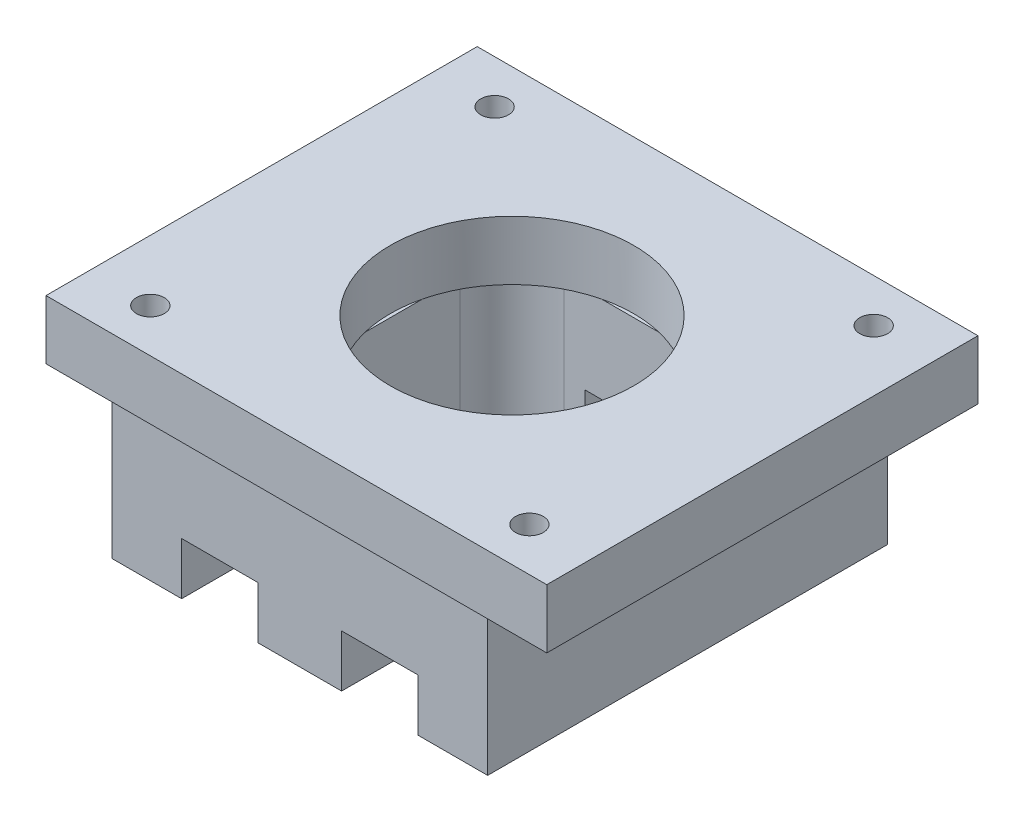
ISO-10303-21;
HEADER;
FILE_DESCRIPTION(('STEP AP214'),'2;1');
FILE_NAME('part.step','',(''),(''),'','','');
FILE_SCHEMA(('AUTOMOTIVE_DESIGN { 1 0 10303 214 1 1 1 1 }'));
ENDSEC;
DATA;
#1=APPLICATION_CONTEXT('core data for automotive mechanical design processes');
#2=APPLICATION_PROTOCOL_DEFINITION('international standard','automotive_design',2000,#1);
#3=PRODUCT_CONTEXT('',#1,'mechanical');
#4=PRODUCT('Part','Part','',(#3));
#5=PRODUCT_RELATED_PRODUCT_CATEGORY('part','',(#4));
#6=PRODUCT_DEFINITION_FORMATION('','',#4);
#7=PRODUCT_DEFINITION_CONTEXT('part definition',#1,'design');
#8=PRODUCT_DEFINITION('design','',#6,#7);
#9=PRODUCT_DEFINITION_SHAPE('','',#8);
#10=(LENGTH_UNIT() NAMED_UNIT(*) SI_UNIT(.MILLI.,.METRE.));
#11=(NAMED_UNIT(*) PLANE_ANGLE_UNIT() SI_UNIT($,.RADIAN.));
#12=(NAMED_UNIT(*) SI_UNIT($,.STERADIAN.) SOLID_ANGLE_UNIT());
#13=UNCERTAINTY_MEASURE_WITH_UNIT(LENGTH_MEASURE(1.E-05),#10,'distance_accuracy_value','');
#14=(GEOMETRIC_REPRESENTATION_CONTEXT(3) GLOBAL_UNCERTAINTY_ASSIGNED_CONTEXT((#13)) GLOBAL_UNIT_ASSIGNED_CONTEXT((#10,
#11,#12)) REPRESENTATION_CONTEXT('',''));
#15=CARTESIAN_POINT('',(0.,0.,0.));
#16=DIRECTION('',(0.,0.,1.));
#17=DIRECTION('',(1.,0.,0.));
#18=AXIS2_PLACEMENT_3D('',#15,#16,#17);
#19=CARTESIAN_POINT('',(0.,-4.,0.));
#20=DIRECTION('',(0.,-1.,0.));
#21=DIRECTION('',(0.,0.,-1.));
#22=AXIS2_PLACEMENT_3D('',#19,#20,#21);
#23=PLANE('',#22);
#24=CARTESIAN_POINT('',(-3.9,-4.,-4.15));
#25=DIRECTION('',(0.,-1.,0.));
#26=DIRECTION('',(0.,0.,-1.));
#27=AXIS2_PLACEMENT_3D('',#24,#25,#26);
#28=CIRCLE('',#27,0.4);
#29=CARTESIAN_POINT('',(-3.9,-4.,-4.55));
#30=VERTEX_POINT('',#29);
#31=EDGE_CURVE('E677',#30,#30,#28,.T.);
#32=ORIENTED_EDGE('',*,*,#31,.F.);
#33=EDGE_LOOP('',(#32));
#34=FACE_BOUND('',#33,.T.);
#35=DIRECTION('',(0.,0.,-1.));
#36=VECTOR('',#35,1.);
#37=CARTESIAN_POINT('',(-1.3,-4.,-3.4));
#38=LINE('',#37,#36);
#39=CARTESIAN_POINT('',(-1.3,-4.,-3.4));
#40=VERTEX_POINT('',#39);
#41=CARTESIAN_POINT('',(-1.3,-4.,-5.4));
#42=VERTEX_POINT('',#41);
#43=EDGE_CURVE('E578',#40,#42,#38,.T.);
#44=ORIENTED_EDGE('',*,*,#43,.F.);
#45=DIRECTION('',(1.,0.,0.));
#46=VECTOR('',#45,1.);
#47=CARTESIAN_POINT('',(-3.4,-4.,-3.4));
#48=LINE('',#47,#46);
#49=CARTESIAN_POINT('',(-1.9,-4.,-3.4));
#50=VERTEX_POINT('',#49);
#51=EDGE_CURVE('E546',#50,#40,#48,.T.);
#52=ORIENTED_EDGE('',*,*,#51,.F.);
#53=CARTESIAN_POINT('',(-1.9,-4.,-1.9));
#54=DIRECTION('',(0.,-1.,0.));
#55=DIRECTION('',(0.,0.,-1.));
#56=AXIS2_PLACEMENT_3D('',#53,#54,#55);
#57=CIRCLE('',#56,1.5);
#58=CARTESIAN_POINT('',(-3.4,-4.,-1.9));
#59=VERTEX_POINT('',#58);
#60=EDGE_CURVE('E12',#50,#59,#57,.F.);
#61=ORIENTED_EDGE('',*,*,#60,.T.);
#62=DIRECTION('',(0.,0.,1.));
#63=VECTOR('',#62,1.);
#64=CARTESIAN_POINT('',(-3.4,-4.,-3.4));
#65=LINE('',#64,#63);
#66=CARTESIAN_POINT('',(-3.4,-4.,6.1));
#67=VERTEX_POINT('',#66);
#68=EDGE_CURVE('E367',#59,#67,#65,.T.);
#69=ORIENTED_EDGE('',*,*,#68,.T.);
#70=DIRECTION('',(1.,0.,0.));
#71=VECTOR('',#70,1.);
#72=CARTESIAN_POINT('',(-3.4,-4.,6.1));
#73=LINE('',#72,#71);
#74=CARTESIAN_POINT('',(-5.4,-4.,6.1));
#75=VERTEX_POINT('',#74);
#76=EDGE_CURVE('E379',#75,#67,#73,.T.);
#77=ORIENTED_EDGE('',*,*,#76,.F.);
#78=DIRECTION('',(0.,0.,1.));
#79=VECTOR('',#78,1.);
#80=CARTESIAN_POINT('',(-5.4,-4.,-3.4));
#81=LINE('',#80,#79);
#82=CARTESIAN_POINT('',(-5.4,-4.,-5.4));
#83=VERTEX_POINT('',#82);
#84=EDGE_CURVE('E382',#83,#75,#81,.T.);
#85=ORIENTED_EDGE('',*,*,#84,.F.);
#86=DIRECTION('',(1.,0.,0.));
#87=VECTOR('',#86,1.);
#88=CARTESIAN_POINT('',(-3.4,-4.,-5.4));
#89=LINE('',#88,#87);
#90=EDGE_CURVE('E371',#83,#42,#89,.T.);
#91=ORIENTED_EDGE('',*,*,#90,.T.);
#92=EDGE_LOOP('',(#44,#52,#61,#69,#77,#85,#91));
#93=FACE_BOUND('',#92,.T.);
#94=ADVANCED_FACE('F136',(#34,#93),#23,.T.);
#95=CARTESIAN_POINT('',(0.,-4.,5.1));
#96=DIRECTION('',(0.,-1.,0.));
#97=DIRECTION('',(0.,0.,-1.));
#98=AXIS2_PLACEMENT_3D('',#95,#96,#97);
#99=CIRCLE('',#98,0.4);
#100=CARTESIAN_POINT('',(0.,-4.,4.7));
#101=VERTEX_POINT('',#100);
#102=EDGE_CURVE('E683',#101,#101,#99,.T.);
#103=ORIENTED_EDGE('',*,*,#102,.F.);
#104=EDGE_LOOP('',(#103));
#105=FACE_BOUND('',#104,.T.);
#106=DIRECTION('',(0.,0.,-1.));
#107=VECTOR('',#106,1.);
#108=CARTESIAN_POINT('',(1.2,-4.,6.1));
#109=LINE('',#108,#107);
#110=CARTESIAN_POINT('',(1.2,-4.,6.1));
#111=VERTEX_POINT('',#110);
#112=CARTESIAN_POINT('',(1.2,-4.,4.1));
#113=VERTEX_POINT('',#112);
#114=EDGE_CURVE('E611',#111,#113,#109,.T.);
#115=ORIENTED_EDGE('',*,*,#114,.F.);
#116=CARTESIAN_POINT('',(-1.2,-4.,6.1));
#117=VERTEX_POINT('',#116);
#118=EDGE_CURVE('E383',#117,#111,#73,.T.);
#119=ORIENTED_EDGE('',*,*,#118,.F.);
#120=DIRECTION('',(0.,0.,1.));
#121=VECTOR('',#120,1.);
#122=CARTESIAN_POINT('',(-1.2,-4.,4.1));
#123=LINE('',#122,#121);
#124=CARTESIAN_POINT('',(-1.2,-4.,4.1));
#125=VERTEX_POINT('',#124);
#126=EDGE_CURVE('E540',#125,#117,#123,.T.);
#127=ORIENTED_EDGE('',*,*,#126,.F.);
#128=DIRECTION('',(1.,0.,0.));
#129=VECTOR('',#128,1.);
#130=CARTESIAN_POINT('',(-3.4,-4.,4.1));
#131=LINE('',#130,#129);
#132=EDGE_CURVE('E550',#125,#113,#131,.T.);
#133=ORIENTED_EDGE('',*,*,#132,.T.);
#134=EDGE_LOOP('',(#115,#119,#127,#133));
#135=FACE_BOUND('',#134,.T.);
#136=ADVANCED_FACE('F609',(#105,#135),#23,.T.);
#137=CARTESIAN_POINT('',(0.,0.,0.));
#138=DIRECTION('',(0.,-1.,0.));
#139=DIRECTION('',(0.,0.,-1.));
#140=AXIS2_PLACEMENT_3D('',#137,#138,#139);
#141=PLANE('',#140);
#142=DIRECTION('',(0.,0.,-1.));
#143=VECTOR('',#142,1.);
#144=CARTESIAN_POINT('',(-7.2,0.,6.2));
#145=LINE('',#144,#143);
#146=CARTESIAN_POINT('',(-7.2,0.,6.2));
#147=VERTEX_POINT('',#146);
#148=CARTESIAN_POINT('',(-7.2,0.,-6.2));
#149=VERTEX_POINT('',#148);
#150=EDGE_CURVE('E442',#147,#149,#145,.T.);
#151=ORIENTED_EDGE('',*,*,#150,.T.);
#152=DIRECTION('',(1.,0.,0.));
#153=VECTOR('',#152,1.);
#154=CARTESIAN_POINT('',(-7.2,0.,-6.2));
#155=LINE('',#154,#153);
#156=CARTESIAN_POINT('',(7.2,0.,-6.2));
#157=VERTEX_POINT('',#156);
#158=EDGE_CURVE('E461',#149,#157,#155,.T.);
#159=ORIENTED_EDGE('',*,*,#158,.T.);
#160=DIRECTION('',(0.,0.,-1.));
#161=VECTOR('',#160,1.);
#162=CARTESIAN_POINT('',(7.2,0.,6.2));
#163=LINE('',#162,#161);
#164=CARTESIAN_POINT('',(7.2,0.,6.2));
#165=VERTEX_POINT('',#164);
#166=EDGE_CURVE('E464',#165,#157,#163,.T.);
#167=ORIENTED_EDGE('',*,*,#166,.F.);
#168=DIRECTION('',(1.,0.,0.));
#169=VECTOR('',#168,1.);
#170=CARTESIAN_POINT('',(-7.2,0.,6.2));
#171=LINE('',#170,#169);
#172=EDGE_CURVE('E451',#147,#165,#171,.T.);
#173=ORIENTED_EDGE('',*,*,#172,.F.);
#174=EDGE_LOOP('',(#151,#159,#167,#173));
#175=FACE_BOUND('',#174,.T.);
#176=CARTESIAN_POINT('',(-5.45,0.,-4.95));
#177=DIRECTION('',(0.,1.,0.));
#178=DIRECTION('',(0.,0.,1.));
#179=AXIS2_PLACEMENT_3D('',#176,#177,#178);
#180=CIRCLE('',#179,0.4);
#181=CARTESIAN_POINT('',(-5.4,0.,-5.34686269665969));
#182=VERTEX_POINT('',#181);
#183=CARTESIAN_POINT('',(-5.4,0.,-4.55313730334031));
#184=VERTEX_POINT('',#183);
#185=EDGE_CURVE('E428',#182,#184,#180,.T.);
#186=ORIENTED_EDGE('',*,*,#185,.T.);
#187=DIRECTION('',(0.,0.,1.));
#188=VECTOR('',#187,1.);
#189=CARTESIAN_POINT('',(-5.4,0.,-3.4));
#190=LINE('',#189,#188);
#191=CARTESIAN_POINT('',(-5.4,0.,4.55313730334031));
#192=VERTEX_POINT('',#191);
#193=EDGE_CURVE('E480',#184,#192,#190,.T.);
#194=ORIENTED_EDGE('',*,*,#193,.T.);
#195=CARTESIAN_POINT('',(-5.45,0.,4.95));
#196=DIRECTION('',(0.,1.,0.));
#197=DIRECTION('',(0.,0.,1.));
#198=AXIS2_PLACEMENT_3D('',#195,#196,#197);
#199=CIRCLE('',#198,0.4);
#200=CARTESIAN_POINT('',(-5.4,0.,5.34686269665969));
#201=VERTEX_POINT('',#200);
#202=EDGE_CURVE('E421',#192,#201,#199,.T.);
#203=ORIENTED_EDGE('',*,*,#202,.T.);
#204=CARTESIAN_POINT('',(-5.4,0.,6.1));
#205=VERTEX_POINT('',#204);
#206=EDGE_CURVE('E398',#201,#205,#190,.T.);
#207=ORIENTED_EDGE('',*,*,#206,.T.);
#208=DIRECTION('',(1.,0.,0.));
#209=VECTOR('',#208,1.);
#210=CARTESIAN_POINT('',(-3.4,0.,6.1));
#211=LINE('',#210,#209);
#212=CARTESIAN_POINT('',(5.4,0.,6.1));
#213=VERTEX_POINT('',#212);
#214=EDGE_CURVE('E390',#205,#213,#211,.T.);
#215=ORIENTED_EDGE('',*,*,#214,.T.);
#216=DIRECTION('',(0.,0.,1.));
#217=VECTOR('',#216,1.);
#218=CARTESIAN_POINT('',(5.4,0.,-3.4));
#219=LINE('',#218,#217);
#220=CARTESIAN_POINT('',(5.4,0.,5.34686269665969));
#221=VERTEX_POINT('',#220);
#222=EDGE_CURVE('E392',#221,#213,#219,.T.);
#223=ORIENTED_EDGE('',*,*,#222,.F.);
#224=CARTESIAN_POINT('',(5.45,0.,4.95));
#225=DIRECTION('',(0.,1.,0.));
#226=DIRECTION('',(0.,0.,1.));
#227=AXIS2_PLACEMENT_3D('',#224,#225,#226);
#228=CIRCLE('',#227,0.4);
#229=CARTESIAN_POINT('',(5.4,0.,4.55313730334031));
#230=VERTEX_POINT('',#229);
#231=EDGE_CURVE('E410',#221,#230,#228,.T.);
#232=ORIENTED_EDGE('',*,*,#231,.T.);
#233=CARTESIAN_POINT('',(5.4,0.,-4.55313730334031));
#234=VERTEX_POINT('',#233);
#235=EDGE_CURVE('E523',#234,#230,#219,.T.);
#236=ORIENTED_EDGE('',*,*,#235,.F.);
#237=CARTESIAN_POINT('',(5.45,0.,-4.95));
#238=DIRECTION('',(0.,1.,0.));
#239=DIRECTION('',(0.,0.,1.));
#240=AXIS2_PLACEMENT_3D('',#237,#238,#239);
#241=CIRCLE('',#240,0.4);
#242=CARTESIAN_POINT('',(5.4,0.,-5.34686269665969));
#243=VERTEX_POINT('',#242);
#244=EDGE_CURVE('E414',#234,#243,#241,.T.);
#245=ORIENTED_EDGE('',*,*,#244,.T.);
#246=CARTESIAN_POINT('',(5.4,0.,-5.4));
#247=VERTEX_POINT('',#246);
#248=EDGE_CURVE('E387',#247,#243,#219,.T.);
#249=ORIENTED_EDGE('',*,*,#248,.F.);
#250=DIRECTION('',(1.,0.,0.));
#251=VECTOR('',#250,1.);
#252=CARTESIAN_POINT('',(-3.4,0.,-5.4));
#253=LINE('',#252,#251);
#254=CARTESIAN_POINT('',(-5.4,0.,-5.4));
#255=VERTEX_POINT('',#254);
#256=EDGE_CURVE('E361',#255,#247,#253,.T.);
#257=ORIENTED_EDGE('',*,*,#256,.F.);
#258=EDGE_CURVE('E395',#255,#182,#190,.T.);
#259=ORIENTED_EDGE('',*,*,#258,.T.);
#260=EDGE_LOOP('',(#186,#194,#203,#207,#215,#223,#232,#236,#245,#249,#257,#259));
#261=FACE_BOUND('',#260,.T.);
#262=ADVANCED_FACE('F657',(#175,#261),#141,.T.);
#263=DIRECTION('',(1.,0.,0.));
#264=VECTOR('',#263,1.);
#265=CARTESIAN_POINT('',(-3.4,0.,-3.4));
#266=LINE('',#265,#264);
#267=CARTESIAN_POINT('',(0.830662386291809,0.,-3.4));
#268=VERTEX_POINT('',#267);
#269=CARTESIAN_POINT('',(1.9,0.,-3.4));
#270=VERTEX_POINT('',#269);
#271=EDGE_CURVE('E511',#268,#270,#266,.T.);
#272=ORIENTED_EDGE('',*,*,#271,.T.);
#273=CARTESIAN_POINT('',(1.9,0.,-1.9));
#274=DIRECTION('',(0.,-1.,0.));
#275=DIRECTION('',(0.,0.,-1.));
#276=AXIS2_PLACEMENT_3D('',#273,#274,#275);
#277=CIRCLE('',#276,1.5);
#278=CARTESIAN_POINT('',(3.4,0.,-1.9));
#279=VERTEX_POINT('',#278);
#280=EDGE_CURVE('E483',#270,#279,#277,.T.);
#281=ORIENTED_EDGE('',*,*,#280,.T.);
#282=DIRECTION('',(0.,0.,1.));
#283=VECTOR('',#282,1.);
#284=CARTESIAN_POINT('',(3.4,0.,-3.4));
#285=LINE('',#284,#283);
#286=CARTESIAN_POINT('',(3.4,0.,-0.830662386291809));
#287=VERTEX_POINT('',#286);
#288=EDGE_CURVE('E525',#279,#287,#285,.T.);
#289=ORIENTED_EDGE('',*,*,#288,.T.);
#290=CARTESIAN_POINT('',(0.,0.,0.));
#291=DIRECTION('',(0.,1.,0.));
#292=DIRECTION('',(0.,0.,1.));
#293=AXIS2_PLACEMENT_3D('',#290,#291,#292);
#294=CIRCLE('',#293,3.5);
#295=EDGE_CURVE('E446',#287,#268,#294,.T.);
#296=ORIENTED_EDGE('',*,*,#295,.T.);
#297=EDGE_LOOP('',(#272,#281,#289,#296));
#298=FACE_BOUND('',#297,.T.);
#299=ADVANCED_FACE('F516',(#298),#141,.T.);
#300=DIRECTION('',(0.,0.,1.));
#301=VECTOR('',#300,1.);
#302=CARTESIAN_POINT('',(-3.4,0.,-3.4));
#303=LINE('',#302,#301);
#304=CARTESIAN_POINT('',(-3.4,0.,-1.9));
#305=VERTEX_POINT('',#304);
#306=CARTESIAN_POINT('',(-3.4,0.,-0.830662386291809));
#307=VERTEX_POINT('',#306);
#308=EDGE_CURVE('E714',#305,#307,#303,.T.);
#309=ORIENTED_EDGE('',*,*,#308,.F.);
#310=CARTESIAN_POINT('',(-1.9,0.,-1.9));
#311=DIRECTION('',(0.,-1.,0.));
#312=DIRECTION('',(0.,0.,-1.));
#313=AXIS2_PLACEMENT_3D('',#310,#311,#312);
#314=CIRCLE('',#313,1.5);
#315=CARTESIAN_POINT('',(-1.9,0.,-3.4));
#316=VERTEX_POINT('',#315);
#317=EDGE_CURVE('E490',#305,#316,#314,.T.);
#318=ORIENTED_EDGE('',*,*,#317,.T.);
#319=CARTESIAN_POINT('',(-0.830662386291809,0.,-3.4));
#320=VERTEX_POINT('',#319);
#321=EDGE_CURVE('E520',#316,#320,#266,.T.);
#322=ORIENTED_EDGE('',*,*,#321,.T.);
#323=EDGE_CURVE('E720',#320,#307,#294,.T.);
#324=ORIENTED_EDGE('',*,*,#323,.T.);
#325=EDGE_LOOP('',(#309,#318,#322,#324));
#326=FACE_BOUND('',#325,.T.);
#327=ADVANCED_FACE('F718',(#326),#141,.T.);
#328=CARTESIAN_POINT('',(-3.4,0.,0.830662386291809));
#329=VERTEX_POINT('',#328);
#330=CARTESIAN_POINT('',(3.4,0.,0.830662386291809));
#331=VERTEX_POINT('',#330);
#332=EDGE_CURVE('E435',#329,#331,#294,.T.);
#333=ORIENTED_EDGE('',*,*,#332,.T.);
#334=CARTESIAN_POINT('',(3.4,0.,4.1));
#335=VERTEX_POINT('',#334);
#336=EDGE_CURVE('E518',#331,#335,#285,.T.);
#337=ORIENTED_EDGE('',*,*,#336,.T.);
#338=DIRECTION('',(1.,0.,0.));
#339=VECTOR('',#338,1.);
#340=CARTESIAN_POINT('',(-3.4,0.,4.1));
#341=LINE('',#340,#339);
#342=CARTESIAN_POINT('',(-3.4,0.,4.1));
#343=VERTEX_POINT('',#342);
#344=EDGE_CURVE('E360',#343,#335,#341,.T.);
#345=ORIENTED_EDGE('',*,*,#344,.F.);
#346=EDGE_CURVE('E470',#329,#343,#303,.T.);
#347=ORIENTED_EDGE('',*,*,#346,.F.);
#348=EDGE_LOOP('',(#333,#337,#345,#347));
#349=FACE_BOUND('',#348,.T.);
#350=ADVANCED_FACE('F727',(#349),#141,.T.);
#351=CARTESIAN_POINT('',(0.,1.7,0.));
#352=DIRECTION('',(0.,-1.,0.));
#353=DIRECTION('',(0.,0.,-1.));
#354=AXIS2_PLACEMENT_3D('',#351,#352,#353);
#355=PLANE('',#354);
#356=DIRECTION('',(0.,0.,-1.));
#357=VECTOR('',#356,1.);
#358=CARTESIAN_POINT('',(-7.2,1.7,6.2));
#359=LINE('',#358,#357);
#360=CARTESIAN_POINT('',(-7.2,1.7,6.2));
#361=VERTEX_POINT('',#360);
#362=CARTESIAN_POINT('',(-7.2,1.7,-6.2));
#363=VERTEX_POINT('',#362);
#364=EDGE_CURVE('E447',#361,#363,#359,.T.);
#365=ORIENTED_EDGE('',*,*,#364,.F.);
#366=DIRECTION('',(1.,0.,0.));
#367=VECTOR('',#366,1.);
#368=CARTESIAN_POINT('',(-7.2,1.7,6.2));
#369=LINE('',#368,#367);
#370=CARTESIAN_POINT('',(7.2,1.7,6.2));
#371=VERTEX_POINT('',#370);
#372=EDGE_CURVE('E456',#361,#371,#369,.T.);
#373=ORIENTED_EDGE('',*,*,#372,.T.);
#374=DIRECTION('',(0.,0.,-1.));
#375=VECTOR('',#374,1.);
#376=CARTESIAN_POINT('',(7.2,1.7,6.2));
#377=LINE('',#376,#375);
#378=CARTESIAN_POINT('',(7.2,1.7,-6.2));
#379=VERTEX_POINT('',#378);
#380=EDGE_CURVE('E454',#371,#379,#377,.T.);
#381=ORIENTED_EDGE('',*,*,#380,.T.);
#382=DIRECTION('',(1.,0.,0.));
#383=VECTOR('',#382,1.);
#384=CARTESIAN_POINT('',(-7.2,1.7,-6.2));
#385=LINE('',#384,#383);
#386=EDGE_CURVE('E450',#363,#379,#385,.T.);
#387=ORIENTED_EDGE('',*,*,#386,.F.);
#388=EDGE_LOOP('',(#365,#373,#381,#387));
#389=FACE_BOUND('',#388,.T.);
#390=CARTESIAN_POINT('',(0.,1.7,0.));
#391=DIRECTION('',(0.,1.,0.));
#392=DIRECTION('',(0.,0.,1.));
#393=AXIS2_PLACEMENT_3D('',#390,#391,#392);
#394=CIRCLE('',#393,3.5);
#395=CARTESIAN_POINT('',(0.,1.7,3.5));
#396=VERTEX_POINT('',#395);
#397=EDGE_CURVE('E439',#396,#396,#394,.T.);
#398=ORIENTED_EDGE('',*,*,#397,.F.);
#399=EDGE_LOOP('',(#398));
#400=FACE_BOUND('',#399,.T.);
#401=CARTESIAN_POINT('',(-5.45,1.7,-4.95));
#402=DIRECTION('',(0.,1.,0.));
#403=DIRECTION('',(0.,0.,1.));
#404=AXIS2_PLACEMENT_3D('',#401,#402,#403);
#405=CIRCLE('',#404,0.4);
#406=CARTESIAN_POINT('',(-5.45,1.7,-4.55));
#407=VERTEX_POINT('',#406);
#408=EDGE_CURVE('E432',#407,#407,#405,.T.);
#409=ORIENTED_EDGE('',*,*,#408,.F.);
#410=EDGE_LOOP('',(#409));
#411=FACE_BOUND('',#410,.T.);
#412=CARTESIAN_POINT('',(-5.45,1.7,4.95));
#413=DIRECTION('',(0.,1.,0.));
#414=DIRECTION('',(0.,0.,1.));
#415=AXIS2_PLACEMENT_3D('',#412,#413,#414);
#416=CIRCLE('',#415,0.4);
#417=CARTESIAN_POINT('',(-5.45,1.7,5.35));
#418=VERTEX_POINT('',#417);
#419=EDGE_CURVE('E425',#418,#418,#416,.T.);
#420=ORIENTED_EDGE('',*,*,#419,.F.);
#421=EDGE_LOOP('',(#420));
#422=FACE_BOUND('',#421,.T.);
#423=CARTESIAN_POINT('',(5.45,1.7,-4.95));
#424=DIRECTION('',(0.,1.,0.));
#425=DIRECTION('',(0.,0.,1.));
#426=AXIS2_PLACEMENT_3D('',#423,#424,#425);
#427=CIRCLE('',#426,0.4);
#428=CARTESIAN_POINT('',(5.45,1.7,-4.55));
#429=VERTEX_POINT('',#428);
#430=EDGE_CURVE('E418',#429,#429,#427,.T.);
#431=ORIENTED_EDGE('',*,*,#430,.F.);
#432=EDGE_LOOP('',(#431));
#433=FACE_BOUND('',#432,.T.);
#434=CARTESIAN_POINT('',(5.45,1.7,4.95));
#435=DIRECTION('',(0.,1.,0.));
#436=DIRECTION('',(0.,0.,1.));
#437=AXIS2_PLACEMENT_3D('',#434,#435,#436);
#438=CIRCLE('',#437,0.4);
#439=CARTESIAN_POINT('',(5.45,1.7,5.35));
#440=VERTEX_POINT('',#439);
#441=EDGE_CURVE('E411',#440,#440,#438,.T.);
#442=ORIENTED_EDGE('',*,*,#441,.F.);
#443=EDGE_LOOP('',(#442));
#444=FACE_BOUND('',#443,.T.);
#445=ADVANCED_FACE('F777',(#389,#400,#411,#422,#433,#444),#355,.F.);
#446=CARTESIAN_POINT('',(-7.2,1.7,6.2));
#447=DIRECTION('',(-1.,0.,0.));
#448=DIRECTION('',(0.,0.,1.));
#449=AXIS2_PLACEMENT_3D('',#446,#447,#448);
#450=PLANE('',#449);
#451=ORIENTED_EDGE('',*,*,#150,.F.);
#452=DIRECTION('',(0.,-1.,0.));
#453=VECTOR('',#452,1.);
#454=CARTESIAN_POINT('',(-7.2,1.7,6.2));
#455=LINE('',#454,#453);
#456=EDGE_CURVE('E468',#361,#147,#455,.T.);
#457=ORIENTED_EDGE('',*,*,#456,.F.);
#458=ORIENTED_EDGE('',*,*,#364,.T.);
#459=DIRECTION('',(0.,-1.,0.));
#460=VECTOR('',#459,1.);
#461=CARTESIAN_POINT('',(-7.2,1.7,-6.2));
#462=LINE('',#461,#460);
#463=EDGE_CURVE('E458',#363,#149,#462,.T.);
#464=ORIENTED_EDGE('',*,*,#463,.T.);
#465=EDGE_LOOP('',(#451,#457,#458,#464));
#466=FACE_BOUND('',#465,.T.);
#467=ADVANCED_FACE('F780',(#466),#450,.T.);
#468=CARTESIAN_POINT('',(-7.2,1.7,6.2));
#469=DIRECTION('',(0.,0.,-1.));
#470=DIRECTION('',(-1.,0.,0.));
#471=AXIS2_PLACEMENT_3D('',#468,#469,#470);
#472=PLANE('',#471);
#473=ORIENTED_EDGE('',*,*,#172,.T.);
#474=DIRECTION('',(0.,-1.,0.));
#475=VECTOR('',#474,1.);
#476=CARTESIAN_POINT('',(7.2,1.7,6.2));
#477=LINE('',#476,#475);
#478=EDGE_CURVE('E471',#371,#165,#477,.T.);
#479=ORIENTED_EDGE('',*,*,#478,.F.);
#480=ORIENTED_EDGE('',*,*,#372,.F.);
#481=ORIENTED_EDGE('',*,*,#456,.T.);
#482=EDGE_LOOP('',(#473,#479,#480,#481));
#483=FACE_BOUND('',#482,.T.);
#484=ADVANCED_FACE('F785',(#483),#472,.F.);
#485=CARTESIAN_POINT('',(7.2,1.7,6.2));
#486=DIRECTION('',(-1.,0.,0.));
#487=DIRECTION('',(0.,0.,1.));
#488=AXIS2_PLACEMENT_3D('',#485,#486,#487);
#489=PLANE('',#488);
#490=ORIENTED_EDGE('',*,*,#166,.T.);
#491=DIRECTION('',(0.,-1.,0.));
#492=VECTOR('',#491,1.);
#493=CARTESIAN_POINT('',(7.2,1.7,-6.2));
#494=LINE('',#493,#492);
#495=EDGE_CURVE('E474',#379,#157,#494,.T.);
#496=ORIENTED_EDGE('',*,*,#495,.F.);
#497=ORIENTED_EDGE('',*,*,#380,.F.);
#498=ORIENTED_EDGE('',*,*,#478,.T.);
#499=EDGE_LOOP('',(#490,#496,#497,#498));
#500=FACE_BOUND('',#499,.T.);
#501=ADVANCED_FACE('F788',(#500),#489,.F.);
#502=CARTESIAN_POINT('',(-7.2,1.7,-6.2));
#503=DIRECTION('',(0.,0.,-1.));
#504=DIRECTION('',(-1.,0.,0.));
#505=AXIS2_PLACEMENT_3D('',#502,#503,#504);
#506=PLANE('',#505);
#507=ORIENTED_EDGE('',*,*,#158,.F.);
#508=ORIENTED_EDGE('',*,*,#463,.F.);
#509=ORIENTED_EDGE('',*,*,#386,.T.);
#510=ORIENTED_EDGE('',*,*,#495,.T.);
#511=EDGE_LOOP('',(#507,#508,#509,#510));
#512=FACE_BOUND('',#511,.T.);
#513=ADVANCED_FACE('F775',(#512),#506,.T.);
#514=CARTESIAN_POINT('',(0.,1.7,0.));
#515=DIRECTION('',(0.,-1.,0.));
#516=DIRECTION('',(0.,0.,-1.));
#517=AXIS2_PLACEMENT_3D('',#514,#515,#516);
#518=CYLINDRICAL_SURFACE('',#517,3.5);
#519=ORIENTED_EDGE('',*,*,#397,.T.);
#520=EDGE_LOOP('',(#519));
#521=FACE_BOUND('',#520,.T.);
#522=EDGE_CURVE('E443',#331,#287,#294,.T.);
#523=ORIENTED_EDGE('',*,*,#522,.F.);
#524=ORIENTED_EDGE('',*,*,#332,.F.);
#525=EDGE_CURVE('E732',#307,#329,#294,.T.);
#526=ORIENTED_EDGE('',*,*,#525,.F.);
#527=ORIENTED_EDGE('',*,*,#323,.F.);
#528=EDGE_CURVE('E735',#268,#320,#294,.T.);
#529=ORIENTED_EDGE('',*,*,#528,.F.);
#530=ORIENTED_EDGE('',*,*,#295,.F.);
#531=EDGE_LOOP('',(#523,#524,#526,#527,#529,#530));
#532=FACE_BOUND('',#531,.T.);
#533=ADVANCED_FACE('F731',(#521,#532),#518,.F.);
#534=CARTESIAN_POINT('',(-5.45,1.7,-4.95));
#535=DIRECTION('',(0.,-1.,0.));
#536=DIRECTION('',(0.,0.,-1.));
#537=AXIS2_PLACEMENT_3D('',#534,#535,#536);
#538=CYLINDRICAL_SURFACE('',#537,0.4);
#539=ORIENTED_EDGE('',*,*,#408,.T.);
#540=EDGE_LOOP('',(#539));
#541=FACE_BOUND('',#540,.T.);
#542=EDGE_CURVE('E436',#184,#182,#180,.T.);
#543=ORIENTED_EDGE('',*,*,#542,.F.);
#544=ORIENTED_EDGE('',*,*,#185,.F.);
#545=EDGE_LOOP('',(#543,#544));
#546=FACE_BOUND('',#545,.T.);
#547=ADVANCED_FACE('F768',(#541,#546),#538,.F.);
#548=CARTESIAN_POINT('',(-5.45,1.7,4.95));
#549=DIRECTION('',(0.,-1.,0.));
#550=DIRECTION('',(0.,0.,-1.));
#551=AXIS2_PLACEMENT_3D('',#548,#549,#550);
#552=CYLINDRICAL_SURFACE('',#551,0.4);
#553=ORIENTED_EDGE('',*,*,#419,.T.);
#554=EDGE_LOOP('',(#553));
#555=FACE_BOUND('',#554,.T.);
#556=EDGE_CURVE('E429',#201,#192,#199,.T.);
#557=ORIENTED_EDGE('',*,*,#556,.F.);
#558=ORIENTED_EDGE('',*,*,#202,.F.);
#559=EDGE_LOOP('',(#557,#558));
#560=FACE_BOUND('',#559,.T.);
#561=ADVANCED_FACE('F764',(#555,#560),#552,.F.);
#562=CARTESIAN_POINT('',(5.45,1.7,-4.95));
#563=DIRECTION('',(0.,-1.,0.));
#564=DIRECTION('',(0.,0.,-1.));
#565=AXIS2_PLACEMENT_3D('',#562,#563,#564);
#566=CYLINDRICAL_SURFACE('',#565,0.4);
#567=ORIENTED_EDGE('',*,*,#430,.T.);
#568=EDGE_LOOP('',(#567));
#569=FACE_BOUND('',#568,.T.);
#570=EDGE_CURVE('E422',#243,#234,#241,.T.);
#571=ORIENTED_EDGE('',*,*,#570,.F.);
#572=ORIENTED_EDGE('',*,*,#244,.F.);
#573=EDGE_LOOP('',(#571,#572));
#574=FACE_BOUND('',#573,.T.);
#575=ADVANCED_FACE('F760',(#569,#574),#566,.F.);
#576=CARTESIAN_POINT('',(5.45,1.7,4.95));
#577=DIRECTION('',(0.,-1.,0.));
#578=DIRECTION('',(0.,0.,-1.));
#579=AXIS2_PLACEMENT_3D('',#576,#577,#578);
#580=CYLINDRICAL_SURFACE('',#579,0.4);
#581=ORIENTED_EDGE('',*,*,#441,.T.);
#582=EDGE_LOOP('',(#581));
#583=FACE_BOUND('',#582,.T.);
#584=EDGE_CURVE('E415',#230,#221,#228,.T.);
#585=ORIENTED_EDGE('',*,*,#584,.F.);
#586=ORIENTED_EDGE('',*,*,#231,.F.);
#587=EDGE_LOOP('',(#585,#586));
#588=FACE_BOUND('',#587,.T.);
#589=ADVANCED_FACE('F750',(#583,#588),#580,.F.);
#590=CARTESIAN_POINT('',(0.,0.,0.));
#591=DIRECTION('',(0.,-1.,0.));
#592=DIRECTION('',(0.,0.,-1.));
#593=AXIS2_PLACEMENT_3D('',#590,#591,#592);
#594=PLANE('',#593);
#595=EDGE_CURVE('E391',#243,#234,#219,.T.);
#596=ORIENTED_EDGE('',*,*,#595,.F.);
#597=ORIENTED_EDGE('',*,*,#570,.T.);
#598=EDGE_LOOP('',(#596,#597));
#599=FACE_BOUND('',#598,.T.);
#600=ADVANCED_FACE('F672',(#599),#594,.F.);
#601=EDGE_CURVE('E397',#182,#184,#190,.T.);
#602=ORIENTED_EDGE('',*,*,#601,.T.);
#603=ORIENTED_EDGE('',*,*,#542,.T.);
#604=EDGE_LOOP('',(#602,#603));
#605=FACE_BOUND('',#604,.T.);
#606=ADVANCED_FACE('F742',(#605),#594,.F.);
#607=EDGE_CURVE('E526',#287,#331,#285,.T.);
#608=ORIENTED_EDGE('',*,*,#607,.T.);
#609=ORIENTED_EDGE('',*,*,#522,.T.);
#610=EDGE_LOOP('',(#608,#609));
#611=FACE_BOUND('',#610,.T.);
#612=ADVANCED_FACE('F740',(#611),#594,.F.);
#613=EDGE_CURVE('E521',#320,#268,#266,.T.);
#614=ORIENTED_EDGE('',*,*,#613,.T.);
#615=ORIENTED_EDGE('',*,*,#528,.T.);
#616=EDGE_LOOP('',(#614,#615));
#617=FACE_BOUND('',#616,.T.);
#618=ADVANCED_FACE('F736',(#617),#594,.F.);
#619=EDGE_CURVE('E722',#307,#329,#303,.T.);
#620=ORIENTED_EDGE('',*,*,#619,.F.);
#621=ORIENTED_EDGE('',*,*,#525,.T.);
#622=EDGE_LOOP('',(#620,#621));
#623=FACE_BOUND('',#622,.T.);
#624=ADVANCED_FACE('F734',(#623),#594,.F.);
#625=EDGE_CURVE('E394',#192,#201,#190,.T.);
#626=ORIENTED_EDGE('',*,*,#625,.T.);
#627=ORIENTED_EDGE('',*,*,#556,.T.);
#628=EDGE_LOOP('',(#626,#627));
#629=FACE_BOUND('',#628,.T.);
#630=ADVANCED_FACE('F670',(#629),#594,.F.);
#631=EDGE_CURVE('E365',#230,#221,#219,.T.);
#632=ORIENTED_EDGE('',*,*,#631,.F.);
#633=ORIENTED_EDGE('',*,*,#584,.T.);
#634=EDGE_LOOP('',(#632,#633));
#635=FACE_BOUND('',#634,.T.);
#636=ADVANCED_FACE('F663',(#635),#594,.F.);
#637=CARTESIAN_POINT('',(3.9,-4.,-4.15));
#638=DIRECTION('',(0.,-1.,0.));
#639=DIRECTION('',(0.,0.,-1.));
#640=AXIS2_PLACEMENT_3D('',#637,#638,#639);
#641=CIRCLE('',#640,0.4);
#642=CARTESIAN_POINT('',(3.9,-4.,-4.55));
#643=VERTEX_POINT('',#642);
#644=EDGE_CURVE('E675',#643,#643,#641,.T.);
#645=ORIENTED_EDGE('',*,*,#644,.F.);
#646=EDGE_LOOP('',(#645));
#647=FACE_BOUND('',#646,.T.);
#648=DIRECTION('',(0.,0.,1.));
#649=VECTOR('',#648,1.);
#650=CARTESIAN_POINT('',(1.3,-4.,-3.4));
#651=LINE('',#650,#649);
#652=CARTESIAN_POINT('',(1.3,-4.,-5.4));
#653=VERTEX_POINT('',#652);
#654=CARTESIAN_POINT('',(1.3,-4.,-3.4));
#655=VERTEX_POINT('',#654);
#656=EDGE_CURVE('E623',#653,#655,#651,.T.);
#657=ORIENTED_EDGE('',*,*,#656,.F.);
#658=CARTESIAN_POINT('',(5.4,-4.,-5.4));
#659=VERTEX_POINT('',#658);
#660=EDGE_CURVE('E375',#653,#659,#89,.T.);
#661=ORIENTED_EDGE('',*,*,#660,.T.);
#662=DIRECTION('',(0.,0.,1.));
#663=VECTOR('',#662,1.);
#664=CARTESIAN_POINT('',(5.4,-4.,-3.4));
#665=LINE('',#664,#663);
#666=CARTESIAN_POINT('',(5.4,-4.,6.1));
#667=VERTEX_POINT('',#666);
#668=EDGE_CURVE('E374',#659,#667,#665,.T.);
#669=ORIENTED_EDGE('',*,*,#668,.T.);
#670=CARTESIAN_POINT('',(3.4,-4.,6.1));
#671=VERTEX_POINT('',#670);
#672=EDGE_CURVE('E378',#671,#667,#73,.T.);
#673=ORIENTED_EDGE('',*,*,#672,.F.);
#674=DIRECTION('',(0.,0.,1.));
#675=VECTOR('',#674,1.);
#676=CARTESIAN_POINT('',(3.4,-4.,-3.4));
#677=LINE('',#676,#675);
#678=CARTESIAN_POINT('',(3.4,-4.,-1.9));
#679=VERTEX_POINT('',#678);
#680=EDGE_CURVE('E501',#679,#671,#677,.T.);
#681=ORIENTED_EDGE('',*,*,#680,.F.);
#682=CARTESIAN_POINT('',(1.9,-4.,-1.9));
#683=DIRECTION('',(0.,-1.,0.));
#684=DIRECTION('',(0.,0.,-1.));
#685=AXIS2_PLACEMENT_3D('',#682,#683,#684);
#686=CIRCLE('',#685,1.5);
#687=CARTESIAN_POINT('',(1.9,-4.,-3.4));
#688=VERTEX_POINT('',#687);
#689=EDGE_CURVE('E144',#679,#688,#686,.F.);
#690=ORIENTED_EDGE('',*,*,#689,.T.);
#691=EDGE_CURVE('E499',#655,#688,#48,.T.);
#692=ORIENTED_EDGE('',*,*,#691,.F.);
#693=EDGE_LOOP('',(#657,#661,#669,#673,#681,#690,#692));
#694=FACE_BOUND('',#693,.T.);
#695=ADVANCED_FACE('F498',(#647,#694),#23,.T.);
#696=CARTESIAN_POINT('',(-3.4,-4.,-5.4));
#697=DIRECTION('',(0.,0.,1.));
#698=DIRECTION('',(1.,0.,0.));
#699=AXIS2_PLACEMENT_3D('',#696,#697,#698);
#700=PLANE('',#699);
#701=DIRECTION('',(1.,0.,0.));
#702=VECTOR('',#701,1.);
#703=CARTESIAN_POINT('',(-1.3,-2.5,-5.4));
#704=LINE('',#703,#702);
#705=CARTESIAN_POINT('',(-1.3,-2.5,-5.4));
#706=VERTEX_POINT('',#705);
#707=CARTESIAN_POINT('',(1.3,-2.5,-5.4));
#708=VERTEX_POINT('',#707);
#709=EDGE_CURVE('E585',#706,#708,#704,.T.);
#710=ORIENTED_EDGE('',*,*,#709,.F.);
#711=DIRECTION('',(0.,-1.,0.));
#712=VECTOR('',#711,1.);
#713=CARTESIAN_POINT('',(-1.3,-2.5,-5.4));
#714=LINE('',#713,#712);
#715=EDGE_CURVE('E583',#706,#42,#714,.T.);
#716=ORIENTED_EDGE('',*,*,#715,.T.);
#717=ORIENTED_EDGE('',*,*,#90,.F.);
#718=DIRECTION('',(0.,1.,0.));
#719=VECTOR('',#718,1.);
#720=CARTESIAN_POINT('',(-5.4,-4.,-5.4));
#721=LINE('',#720,#719);
#722=EDGE_CURVE('E385',#83,#255,#721,.T.);
#723=ORIENTED_EDGE('',*,*,#722,.T.);
#724=ORIENTED_EDGE('',*,*,#256,.T.);
#725=DIRECTION('',(0.,1.,0.));
#726=VECTOR('',#725,1.);
#727=CARTESIAN_POINT('',(5.4,-4.,-5.4));
#728=LINE('',#727,#726);
#729=EDGE_CURVE('E407',#659,#247,#728,.T.);
#730=ORIENTED_EDGE('',*,*,#729,.F.);
#731=ORIENTED_EDGE('',*,*,#660,.F.);
#732=DIRECTION('',(0.,-1.,0.));
#733=VECTOR('',#732,1.);
#734=CARTESIAN_POINT('',(1.3,-2.5,-5.4));
#735=LINE('',#734,#733);
#736=EDGE_CURVE('E588',#708,#653,#735,.T.);
#737=ORIENTED_EDGE('',*,*,#736,.F.);
#738=EDGE_LOOP('',(#710,#716,#717,#723,#724,#730,#731,#737));
#739=FACE_BOUND('',#738,.T.);
#740=ADVANCED_FACE('F582',(#739),#700,.F.);
#741=CARTESIAN_POINT('',(5.4,-4.,-3.4));
#742=DIRECTION('',(-1.,0.,0.));
#743=DIRECTION('',(0.,0.,1.));
#744=AXIS2_PLACEMENT_3D('',#741,#742,#743);
#745=PLANE('',#744);
#746=ORIENTED_EDGE('',*,*,#248,.T.);
#747=ORIENTED_EDGE('',*,*,#595,.T.);
#748=ORIENTED_EDGE('',*,*,#235,.T.);
#749=ORIENTED_EDGE('',*,*,#631,.T.);
#750=ORIENTED_EDGE('',*,*,#222,.T.);
#751=DIRECTION('',(0.,1.,0.));
#752=VECTOR('',#751,1.);
#753=CARTESIAN_POINT('',(5.4,-4.,6.1));
#754=LINE('',#753,#752);
#755=EDGE_CURVE('E404',#667,#213,#754,.T.);
#756=ORIENTED_EDGE('',*,*,#755,.F.);
#757=ORIENTED_EDGE('',*,*,#668,.F.);
#758=ORIENTED_EDGE('',*,*,#729,.T.);
#759=EDGE_LOOP('',(#746,#747,#748,#749,#750,#756,#757,#758));
#760=FACE_BOUND('',#759,.T.);
#761=ADVANCED_FACE('F637',(#760),#745,.F.);
#762=CARTESIAN_POINT('',(-3.4,-4.,6.1));
#763=DIRECTION('',(0.,0.,1.));
#764=DIRECTION('',(1.,0.,0.));
#765=AXIS2_PLACEMENT_3D('',#762,#763,#764);
#766=PLANE('',#765);
#767=DIRECTION('',(0.,-1.,0.));
#768=VECTOR('',#767,1.);
#769=CARTESIAN_POINT('',(1.2,-2.5,6.1));
#770=LINE('',#769,#768);
#771=CARTESIAN_POINT('',(1.2,-2.5,6.1));
#772=VERTEX_POINT('',#771);
#773=EDGE_CURVE('E613',#772,#111,#770,.T.);
#774=ORIENTED_EDGE('',*,*,#773,.F.);
#775=DIRECTION('',(-1.,0.,0.));
#776=VECTOR('',#775,1.);
#777=CARTESIAN_POINT('',(1.2,-2.5,6.1));
#778=LINE('',#777,#776);
#779=CARTESIAN_POINT('',(3.4,-2.5,6.1));
#780=VERTEX_POINT('',#779);
#781=EDGE_CURVE('E349',#780,#772,#778,.T.);
#782=ORIENTED_EDGE('',*,*,#781,.F.);
#783=DIRECTION('',(0.,-1.,0.));
#784=VECTOR('',#783,1.);
#785=CARTESIAN_POINT('',(3.4,-2.5,6.1));
#786=LINE('',#785,#784);
#787=EDGE_CURVE('E347',#780,#671,#786,.T.);
#788=ORIENTED_EDGE('',*,*,#787,.T.);
#789=ORIENTED_EDGE('',*,*,#672,.T.);
#790=ORIENTED_EDGE('',*,*,#755,.T.);
#791=ORIENTED_EDGE('',*,*,#214,.F.);
#792=DIRECTION('',(0.,1.,0.));
#793=VECTOR('',#792,1.);
#794=CARTESIAN_POINT('',(-5.4,-4.,6.1));
#795=LINE('',#794,#793);
#796=EDGE_CURVE('E401',#75,#205,#795,.T.);
#797=ORIENTED_EDGE('',*,*,#796,.F.);
#798=ORIENTED_EDGE('',*,*,#76,.T.);
#799=DIRECTION('',(0.,-1.,0.));
#800=VECTOR('',#799,1.);
#801=CARTESIAN_POINT('',(-3.4,-2.5,6.1));
#802=LINE('',#801,#800);
#803=CARTESIAN_POINT('',(-3.4,-2.5,6.1));
#804=VERTEX_POINT('',#803);
#805=EDGE_CURVE('E531',#804,#67,#802,.T.);
#806=ORIENTED_EDGE('',*,*,#805,.F.);
#807=DIRECTION('',(-1.,0.,0.));
#808=VECTOR('',#807,1.);
#809=CARTESIAN_POINT('',(-1.2,-2.5,6.1));
#810=LINE('',#809,#808);
#811=CARTESIAN_POINT('',(-1.2,-2.5,6.1));
#812=VERTEX_POINT('',#811);
#813=EDGE_CURVE('E599',#812,#804,#810,.T.);
#814=ORIENTED_EDGE('',*,*,#813,.F.);
#815=DIRECTION('',(0.,-1.,0.));
#816=VECTOR('',#815,1.);
#817=CARTESIAN_POINT('',(-1.2,-2.5,6.1));
#818=LINE('',#817,#816);
#819=EDGE_CURVE('E537',#812,#117,#818,.T.);
#820=ORIENTED_EDGE('',*,*,#819,.T.);
#821=ORIENTED_EDGE('',*,*,#118,.T.);
#822=EDGE_LOOP('',(#774,#782,#788,#789,#790,#791,#797,#798,#806,#814,#820,#821));
#823=FACE_BOUND('',#822,.T.);
#824=ADVANCED_FACE('F569',(#823),#766,.T.);
#825=CARTESIAN_POINT('',(-5.4,-4.,-3.4));
#826=DIRECTION('',(-1.,0.,0.));
#827=DIRECTION('',(0.,0.,1.));
#828=AXIS2_PLACEMENT_3D('',#825,#826,#827);
#829=PLANE('',#828);
#830=ORIENTED_EDGE('',*,*,#258,.F.);
#831=ORIENTED_EDGE('',*,*,#722,.F.);
#832=ORIENTED_EDGE('',*,*,#84,.T.);
#833=ORIENTED_EDGE('',*,*,#796,.T.);
#834=ORIENTED_EDGE('',*,*,#206,.F.);
#835=ORIENTED_EDGE('',*,*,#625,.F.);
#836=ORIENTED_EDGE('',*,*,#193,.F.);
#837=ORIENTED_EDGE('',*,*,#601,.F.);
#838=EDGE_LOOP('',(#830,#831,#832,#833,#834,#835,#836,#837));
#839=FACE_BOUND('',#838,.T.);
#840=ADVANCED_FACE('F574',(#839),#829,.T.);
#841=CARTESIAN_POINT('',(-3.4,-4.,-3.4));
#842=DIRECTION('',(0.,0.,1.));
#843=DIRECTION('',(1.,0.,0.));
#844=AXIS2_PLACEMENT_3D('',#841,#842,#843);
#845=PLANE('',#844);
#846=DIRECTION('',(0.,-1.,0.));
#847=VECTOR('',#846,1.);
#848=CARTESIAN_POINT('',(-1.3,-2.5,-3.4));
#849=LINE('',#848,#847);
#850=CARTESIAN_POINT('',(-1.3,-2.5,-3.4));
#851=VERTEX_POINT('',#850);
#852=EDGE_CURVE('E629',#851,#40,#849,.T.);
#853=ORIENTED_EDGE('',*,*,#852,.F.);
#854=DIRECTION('',(-1.,0.,0.));
#855=VECTOR('',#854,1.);
#856=CARTESIAN_POINT('',(-1.3,-2.5,-3.4));
#857=LINE('',#856,#855);
#858=CARTESIAN_POINT('',(1.3,-2.5,-3.4));
#859=VERTEX_POINT('',#858);
#860=EDGE_CURVE('E589',#859,#851,#857,.T.);
#861=ORIENTED_EDGE('',*,*,#860,.F.);
#862=DIRECTION('',(0.,-1.,0.));
#863=VECTOR('',#862,1.);
#864=CARTESIAN_POINT('',(1.3,-2.5,-3.4));
#865=LINE('',#864,#863);
#866=EDGE_CURVE('E591',#859,#655,#865,.T.);
#867=ORIENTED_EDGE('',*,*,#866,.T.);
#868=ORIENTED_EDGE('',*,*,#691,.T.);
#869=DIRECTION('',(0.,1.,0.));
#870=VECTOR('',#869,1.);
#871=CARTESIAN_POINT('',(1.9,0.,-3.4));
#872=LINE('',#871,#870);
#873=EDGE_CURVE('E479',#688,#270,#872,.T.);
#874=ORIENTED_EDGE('',*,*,#873,.T.);
#875=ORIENTED_EDGE('',*,*,#271,.F.);
#876=ORIENTED_EDGE('',*,*,#613,.F.);
#877=ORIENTED_EDGE('',*,*,#321,.F.);
#878=DIRECTION('',(0.,1.,0.));
#879=VECTOR('',#878,1.);
#880=CARTESIAN_POINT('',(-1.9,-4.,-3.4));
#881=LINE('',#880,#879);
#882=EDGE_CURVE('E477',#316,#50,#881,.F.);
#883=ORIENTED_EDGE('',*,*,#882,.T.);
#884=ORIENTED_EDGE('',*,*,#51,.T.);
#885=EDGE_LOOP('',(#853,#861,#867,#868,#874,#875,#876,#877,#883,#884));
#886=FACE_BOUND('',#885,.T.);
#887=ADVANCED_FACE('F509',(#886),#845,.T.);
#888=CARTESIAN_POINT('',(3.4,-4.,-3.4));
#889=DIRECTION('',(-1.,0.,0.));
#890=DIRECTION('',(0.,0.,1.));
#891=AXIS2_PLACEMENT_3D('',#888,#889,#890);
#892=PLANE('',#891);
#893=ORIENTED_EDGE('',*,*,#288,.F.);
#894=DIRECTION('',(0.,1.,0.));
#895=VECTOR('',#894,1.);
#896=CARTESIAN_POINT('',(3.4,-4.,-1.9));
#897=LINE('',#896,#895);
#898=EDGE_CURVE('E485',#279,#679,#897,.F.);
#899=ORIENTED_EDGE('',*,*,#898,.T.);
#900=ORIENTED_EDGE('',*,*,#680,.T.);
#901=ORIENTED_EDGE('',*,*,#787,.F.);
#902=DIRECTION('',(0.,0.,1.));
#903=VECTOR('',#902,1.);
#904=CARTESIAN_POINT('',(3.4,-2.5,6.1));
#905=LINE('',#904,#903);
#906=CARTESIAN_POINT('',(3.4,-2.5,4.1));
#907=VERTEX_POINT('',#906);
#908=EDGE_CURVE('E339',#907,#780,#905,.T.);
#909=ORIENTED_EDGE('',*,*,#908,.F.);
#910=DIRECTION('',(0.,1.,0.));
#911=VECTOR('',#910,1.);
#912=CARTESIAN_POINT('',(3.4,-4.,4.1));
#913=LINE('',#912,#911);
#914=EDGE_CURVE('E344',#907,#335,#913,.T.);
#915=ORIENTED_EDGE('',*,*,#914,.T.);
#916=ORIENTED_EDGE('',*,*,#336,.F.);
#917=ORIENTED_EDGE('',*,*,#607,.F.);
#918=EDGE_LOOP('',(#893,#899,#900,#901,#909,#915,#916,#917));
#919=FACE_BOUND('',#918,.T.);
#920=ADVANCED_FACE('F341',(#919),#892,.T.);
#921=CARTESIAN_POINT('',(-3.4,-4.,4.1));
#922=DIRECTION('',(0.,0.,1.));
#923=DIRECTION('',(1.,0.,0.));
#924=AXIS2_PLACEMENT_3D('',#921,#922,#923);
#925=PLANE('',#924);
#926=DIRECTION('',(1.,0.,0.));
#927=VECTOR('',#926,1.);
#928=CARTESIAN_POINT('',(1.2,-2.5,4.1));
#929=LINE('',#928,#927);
#930=CARTESIAN_POINT('',(1.2,-2.5,4.1));
#931=VERTEX_POINT('',#930);
#932=EDGE_CURVE('E350',#931,#907,#929,.T.);
#933=ORIENTED_EDGE('',*,*,#932,.F.);
#934=DIRECTION('',(0.,-1.,0.));
#935=VECTOR('',#934,1.);
#936=CARTESIAN_POINT('',(1.2,-2.5,4.1));
#937=LINE('',#936,#935);
#938=EDGE_CURVE('E606',#931,#113,#937,.T.);
#939=ORIENTED_EDGE('',*,*,#938,.T.);
#940=ORIENTED_EDGE('',*,*,#132,.F.);
#941=DIRECTION('',(0.,-1.,0.));
#942=VECTOR('',#941,1.);
#943=CARTESIAN_POINT('',(-1.2,-2.5,4.1));
#944=LINE('',#943,#942);
#945=CARTESIAN_POINT('',(-1.2,-2.5,4.1));
#946=VERTEX_POINT('',#945);
#947=EDGE_CURVE('E528',#946,#125,#944,.T.);
#948=ORIENTED_EDGE('',*,*,#947,.F.);
#949=DIRECTION('',(1.,0.,0.));
#950=VECTOR('',#949,1.);
#951=CARTESIAN_POINT('',(-1.2,-2.5,4.1));
#952=LINE('',#951,#950);
#953=CARTESIAN_POINT('',(-3.4,-2.5,4.1));
#954=VERTEX_POINT('',#953);
#955=EDGE_CURVE('E545',#954,#946,#952,.T.);
#956=ORIENTED_EDGE('',*,*,#955,.F.);
#957=DIRECTION('',(0.,1.,0.));
#958=VECTOR('',#957,1.);
#959=CARTESIAN_POINT('',(-3.4,-4.,4.1));
#960=LINE('',#959,#958);
#961=EDGE_CURVE('E362',#954,#343,#960,.T.);
#962=ORIENTED_EDGE('',*,*,#961,.T.);
#963=ORIENTED_EDGE('',*,*,#344,.T.);
#964=ORIENTED_EDGE('',*,*,#914,.F.);
#965=EDGE_LOOP('',(#933,#939,#940,#948,#956,#962,#963,#964));
#966=FACE_BOUND('',#965,.T.);
#967=ADVANCED_FACE('F358',(#966),#925,.F.);
#968=CARTESIAN_POINT('',(-3.4,-4.,-3.4));
#969=DIRECTION('',(-1.,0.,0.));
#970=DIRECTION('',(0.,0.,1.));
#971=AXIS2_PLACEMENT_3D('',#968,#969,#970);
#972=PLANE('',#971);
#973=ORIENTED_EDGE('',*,*,#68,.F.);
#974=DIRECTION('',(0.,1.,0.));
#975=VECTOR('',#974,1.);
#976=CARTESIAN_POINT('',(-3.4,-4.,-1.9));
#977=LINE('',#976,#975);
#978=EDGE_CURVE('E487',#59,#305,#977,.T.);
#979=ORIENTED_EDGE('',*,*,#978,.T.);
#980=ORIENTED_EDGE('',*,*,#308,.T.);
#981=ORIENTED_EDGE('',*,*,#619,.T.);
#982=ORIENTED_EDGE('',*,*,#346,.T.);
#983=ORIENTED_EDGE('',*,*,#961,.F.);
#984=DIRECTION('',(0.,0.,-1.));
#985=VECTOR('',#984,1.);
#986=CARTESIAN_POINT('',(-3.4,-2.5,4.1));
#987=LINE('',#986,#985);
#988=EDGE_CURVE('E564',#804,#954,#987,.T.);
#989=ORIENTED_EDGE('',*,*,#988,.F.);
#990=ORIENTED_EDGE('',*,*,#805,.T.);
#991=EDGE_LOOP('',(#973,#979,#980,#981,#982,#983,#989,#990));
#992=FACE_BOUND('',#991,.T.);
#993=ADVANCED_FACE('F562',(#992),#972,.F.);
#994=CARTESIAN_POINT('',(1.9,-4.,-1.9));
#995=DIRECTION('',(0.,-1.,0.));
#996=DIRECTION('',(0.,0.,-1.));
#997=AXIS2_PLACEMENT_3D('',#994,#995,#996);
#998=CYLINDRICAL_SURFACE('',#997,1.5);
#999=ORIENTED_EDGE('',*,*,#689,.F.);
#1000=ORIENTED_EDGE('',*,*,#898,.F.);
#1001=ORIENTED_EDGE('',*,*,#280,.F.);
#1002=ORIENTED_EDGE('',*,*,#873,.F.);
#1003=EDGE_LOOP('',(#999,#1000,#1001,#1002));
#1004=FACE_BOUND('',#1003,.T.);
#1005=ADVANCED_FACE('F504',(#1004),#998,.F.);
#1006=CARTESIAN_POINT('',(-1.9,-4.,-1.9));
#1007=DIRECTION('',(0.,1.,0.));
#1008=DIRECTION('',(0.,0.,1.));
#1009=AXIS2_PLACEMENT_3D('',#1006,#1007,#1008);
#1010=CYLINDRICAL_SURFACE('',#1009,1.5);
#1011=ORIENTED_EDGE('',*,*,#60,.F.);
#1012=ORIENTED_EDGE('',*,*,#882,.F.);
#1013=ORIENTED_EDGE('',*,*,#317,.F.);
#1014=ORIENTED_EDGE('',*,*,#978,.F.);
#1015=EDGE_LOOP('',(#1011,#1012,#1013,#1014));
#1016=FACE_BOUND('',#1015,.T.);
#1017=ADVANCED_FACE('F138',(#1016),#1010,.F.);
#1018=CARTESIAN_POINT('',(-1.2,-2.5,4.1));
#1019=DIRECTION('',(1.,0.,0.));
#1020=DIRECTION('',(0.,0.,-1.));
#1021=AXIS2_PLACEMENT_3D('',#1018,#1019,#1020);
#1022=PLANE('',#1021);
#1023=ORIENTED_EDGE('',*,*,#126,.T.);
#1024=ORIENTED_EDGE('',*,*,#819,.F.);
#1025=DIRECTION('',(0.,0.,1.));
#1026=VECTOR('',#1025,1.);
#1027=CARTESIAN_POINT('',(-1.2,-2.5,4.1));
#1028=LINE('',#1027,#1026);
#1029=EDGE_CURVE('E596',#946,#812,#1028,.T.);
#1030=ORIENTED_EDGE('',*,*,#1029,.F.);
#1031=ORIENTED_EDGE('',*,*,#947,.T.);
#1032=EDGE_LOOP('',(#1023,#1024,#1030,#1031));
#1033=FACE_BOUND('',#1032,.T.);
#1034=ADVANCED_FACE('F640',(#1033),#1022,.F.);
#1035=CARTESIAN_POINT('',(0.,-2.5,0.));
#1036=DIRECTION('',(0.,-1.,0.));
#1037=DIRECTION('',(0.,0.,-1.));
#1038=AXIS2_PLACEMENT_3D('',#1035,#1036,#1037);
#1039=PLANE('',#1038);
#1040=ORIENTED_EDGE('',*,*,#1029,.T.);
#1041=ORIENTED_EDGE('',*,*,#813,.T.);
#1042=ORIENTED_EDGE('',*,*,#988,.T.);
#1043=ORIENTED_EDGE('',*,*,#955,.T.);
#1044=EDGE_LOOP('',(#1040,#1041,#1042,#1043));
#1045=FACE_BOUND('',#1044,.T.);
#1046=ADVANCED_FACE('F604',(#1045),#1039,.T.);
#1047=CARTESIAN_POINT('',(1.2,-2.5,6.1));
#1048=DIRECTION('',(-1.,0.,0.));
#1049=DIRECTION('',(0.,0.,1.));
#1050=AXIS2_PLACEMENT_3D('',#1047,#1048,#1049);
#1051=PLANE('',#1050);
#1052=ORIENTED_EDGE('',*,*,#114,.T.);
#1053=ORIENTED_EDGE('',*,*,#938,.F.);
#1054=DIRECTION('',(0.,0.,-1.));
#1055=VECTOR('',#1054,1.);
#1056=CARTESIAN_POINT('',(1.2,-2.5,6.1));
#1057=LINE('',#1056,#1055);
#1058=EDGE_CURVE('E159',#772,#931,#1057,.T.);
#1059=ORIENTED_EDGE('',*,*,#1058,.F.);
#1060=ORIENTED_EDGE('',*,*,#773,.T.);
#1061=EDGE_LOOP('',(#1052,#1053,#1059,#1060));
#1062=FACE_BOUND('',#1061,.T.);
#1063=ADVANCED_FACE('F647',(#1062),#1051,.F.);
#1064=CARTESIAN_POINT('',(0.,-2.5,0.));
#1065=DIRECTION('',(0.,-1.,0.));
#1066=DIRECTION('',(0.,0.,-1.));
#1067=AXIS2_PLACEMENT_3D('',#1064,#1065,#1066);
#1068=PLANE('',#1067);
#1069=ORIENTED_EDGE('',*,*,#1058,.T.);
#1070=ORIENTED_EDGE('',*,*,#932,.T.);
#1071=ORIENTED_EDGE('',*,*,#908,.T.);
#1072=ORIENTED_EDGE('',*,*,#781,.T.);
#1073=EDGE_LOOP('',(#1069,#1070,#1071,#1072));
#1074=FACE_BOUND('',#1073,.T.);
#1075=ADVANCED_FACE('F353',(#1074),#1068,.T.);
#1076=CARTESIAN_POINT('',(-1.3,-2.5,-3.4));
#1077=DIRECTION('',(-1.,0.,0.));
#1078=DIRECTION('',(0.,0.,1.));
#1079=AXIS2_PLACEMENT_3D('',#1076,#1077,#1078);
#1080=PLANE('',#1079);
#1081=ORIENTED_EDGE('',*,*,#43,.T.);
#1082=ORIENTED_EDGE('',*,*,#715,.F.);
#1083=DIRECTION('',(0.,0.,-1.));
#1084=VECTOR('',#1083,1.);
#1085=CARTESIAN_POINT('',(-1.3,-2.5,-3.4));
#1086=LINE('',#1085,#1084);
#1087=EDGE_CURVE('E621',#851,#706,#1086,.T.);
#1088=ORIENTED_EDGE('',*,*,#1087,.F.);
#1089=ORIENTED_EDGE('',*,*,#852,.T.);
#1090=EDGE_LOOP('',(#1081,#1082,#1088,#1089));
#1091=FACE_BOUND('',#1090,.T.);
#1092=ADVANCED_FACE('F697',(#1091),#1080,.F.);
#1093=CARTESIAN_POINT('',(1.3,-2.5,-3.4));
#1094=DIRECTION('',(1.,0.,0.));
#1095=DIRECTION('',(0.,0.,-1.));
#1096=AXIS2_PLACEMENT_3D('',#1093,#1094,#1095);
#1097=PLANE('',#1096);
#1098=ORIENTED_EDGE('',*,*,#656,.T.);
#1099=ORIENTED_EDGE('',*,*,#866,.F.);
#1100=DIRECTION('',(0.,0.,1.));
#1101=VECTOR('',#1100,1.);
#1102=CARTESIAN_POINT('',(1.3,-2.5,-3.4));
#1103=LINE('',#1102,#1101);
#1104=EDGE_CURVE('E151',#708,#859,#1103,.T.);
#1105=ORIENTED_EDGE('',*,*,#1104,.F.);
#1106=ORIENTED_EDGE('',*,*,#736,.T.);
#1107=EDGE_LOOP('',(#1098,#1099,#1105,#1106));
#1108=FACE_BOUND('',#1107,.T.);
#1109=ADVANCED_FACE('F632',(#1108),#1097,.F.);
#1110=CARTESIAN_POINT('',(0.,-2.5,0.));
#1111=DIRECTION('',(0.,-1.,0.));
#1112=DIRECTION('',(0.,0.,-1.));
#1113=AXIS2_PLACEMENT_3D('',#1110,#1111,#1112);
#1114=PLANE('',#1113);
#1115=ORIENTED_EDGE('',*,*,#1087,.T.);
#1116=ORIENTED_EDGE('',*,*,#709,.T.);
#1117=ORIENTED_EDGE('',*,*,#1104,.T.);
#1118=ORIENTED_EDGE('',*,*,#860,.T.);
#1119=EDGE_LOOP('',(#1115,#1116,#1117,#1118));
#1120=FACE_BOUND('',#1119,.T.);
#1121=ADVANCED_FACE('F701',(#1120),#1114,.T.);
#1122=CARTESIAN_POINT('',(3.9,-1.,-4.15));
#1123=DIRECTION('',(0.,-1.,0.));
#1124=DIRECTION('',(0.,0.,-1.));
#1125=AXIS2_PLACEMENT_3D('',#1122,#1123,#1124);
#1126=CYLINDRICAL_SURFACE('',#1125,0.4);
#1127=CARTESIAN_POINT('',(3.9,-1.,-4.15));
#1128=DIRECTION('',(0.,-1.,0.));
#1129=DIRECTION('',(0.,0.,-1.));
#1130=AXIS2_PLACEMENT_3D('',#1127,#1128,#1129);
#1131=CIRCLE('',#1130,0.4);
#1132=CARTESIAN_POINT('',(3.9,-1.,-4.55));
#1133=VERTEX_POINT('',#1132);
#1134=EDGE_CURVE('E678',#1133,#1133,#1131,.T.);
#1135=ORIENTED_EDGE('',*,*,#1134,.F.);
#1136=EDGE_LOOP('',(#1135));
#1137=FACE_BOUND('',#1136,.T.);
#1138=ORIENTED_EDGE('',*,*,#644,.T.);
#1139=EDGE_LOOP('',(#1138));
#1140=FACE_BOUND('',#1139,.T.);
#1141=ADVANCED_FACE('F704',(#1137,#1140),#1126,.F.);
#1142=CARTESIAN_POINT('',(3.9,-1.,-4.15));
#1143=DIRECTION('',(0.,-1.,0.));
#1144=DIRECTION('',(0.,0.,-1.));
#1145=AXIS2_PLACEMENT_3D('',#1142,#1143,#1144);
#1146=PLANE('',#1145);
#1147=ORIENTED_EDGE('',*,*,#1134,.T.);
#1148=EDGE_LOOP('',(#1147));
#1149=FACE_BOUND('',#1148,.T.);
#1150=ADVANCED_FACE('F890',(#1149),#1146,.T.);
#1151=CARTESIAN_POINT('',(0.,-1.,5.1));
#1152=DIRECTION('',(0.,-1.,0.));
#1153=DIRECTION('',(0.,0.,-1.));
#1154=AXIS2_PLACEMENT_3D('',#1151,#1152,#1153);
#1155=CYLINDRICAL_SURFACE('',#1154,0.4);
#1156=CARTESIAN_POINT('',(0.,-1.,5.1));
#1157=DIRECTION('',(0.,-1.,0.));
#1158=DIRECTION('',(0.,0.,-1.));
#1159=AXIS2_PLACEMENT_3D('',#1156,#1157,#1158);
#1160=CIRCLE('',#1159,0.4);
#1161=CARTESIAN_POINT('',(0.,-1.,4.7));
#1162=VERTEX_POINT('',#1161);
#1163=EDGE_CURVE('E689',#1162,#1162,#1160,.T.);
#1164=ORIENTED_EDGE('',*,*,#1163,.F.);
#1165=EDGE_LOOP('',(#1164));
#1166=FACE_BOUND('',#1165,.T.);
#1167=ORIENTED_EDGE('',*,*,#102,.T.);
#1168=EDGE_LOOP('',(#1167));
#1169=FACE_BOUND('',#1168,.T.);
#1170=ADVANCED_FACE('F900',(#1166,#1169),#1155,.F.);
#1171=CARTESIAN_POINT('',(0.,-1.,5.1));
#1172=DIRECTION('',(0.,-1.,0.));
#1173=DIRECTION('',(0.,0.,-1.));
#1174=AXIS2_PLACEMENT_3D('',#1171,#1172,#1173);
#1175=PLANE('',#1174);
#1176=ORIENTED_EDGE('',*,*,#1163,.T.);
#1177=EDGE_LOOP('',(#1176));
#1178=FACE_BOUND('',#1177,.T.);
#1179=ADVANCED_FACE('F910',(#1178),#1175,.T.);
#1180=CARTESIAN_POINT('',(-3.9,-1.,-4.15));
#1181=DIRECTION('',(0.,-1.,0.));
#1182=DIRECTION('',(0.,0.,-1.));
#1183=AXIS2_PLACEMENT_3D('',#1180,#1181,#1182);
#1184=CYLINDRICAL_SURFACE('',#1183,0.4);
#1185=CARTESIAN_POINT('',(-3.9,-1.,-4.15));
#1186=DIRECTION('',(0.,-1.,0.));
#1187=DIRECTION('',(0.,0.,-1.));
#1188=AXIS2_PLACEMENT_3D('',#1185,#1186,#1187);
#1189=CIRCLE('',#1188,0.4);
#1190=CARTESIAN_POINT('',(-3.9,-1.,-4.55));
#1191=VERTEX_POINT('',#1190);
#1192=EDGE_CURVE('E627',#1191,#1191,#1189,.T.);
#1193=ORIENTED_EDGE('',*,*,#1192,.F.);
#1194=EDGE_LOOP('',(#1193));
#1195=FACE_BOUND('',#1194,.T.);
#1196=ORIENTED_EDGE('',*,*,#31,.T.);
#1197=EDGE_LOOP('',(#1196));
#1198=FACE_BOUND('',#1197,.T.);
#1199=ADVANCED_FACE('F920',(#1195,#1198),#1184,.F.);
#1200=CARTESIAN_POINT('',(-3.9,-1.,-4.15));
#1201=DIRECTION('',(0.,-1.,0.));
#1202=DIRECTION('',(0.,0.,-1.));
#1203=AXIS2_PLACEMENT_3D('',#1200,#1201,#1202);
#1204=PLANE('',#1203);
#1205=ORIENTED_EDGE('',*,*,#1192,.T.);
#1206=EDGE_LOOP('',(#1205));
#1207=FACE_BOUND('',#1206,.T.);
#1208=ADVANCED_FACE('F929',(#1207),#1204,.T.);
#1209=CLOSED_SHELL('',(#94,#136,#262,#299,#327,#350,#445,#467,#484,#501,#513,#533,#547,#561,
#575,#589,#600,#606,#612,#618,#624,#630,#636,#695,#740,#761,#824,#840,#887,#920,#967,#993,#1005,
#1017,#1034,#1046,#1063,#1075,#1092,#1109,#1121,#1141,#1150,#1170,#1179,#1199,#1208));
#1210=MANIFOLD_SOLID_BREP('B2',#1209);
#1211=ADVANCED_BREP_SHAPE_REPRESENTATION('',(#18,#1210),#14);
#1212=SHAPE_DEFINITION_REPRESENTATION(#9,#1211);
ENDSEC;
END-ISO-10303-21;
